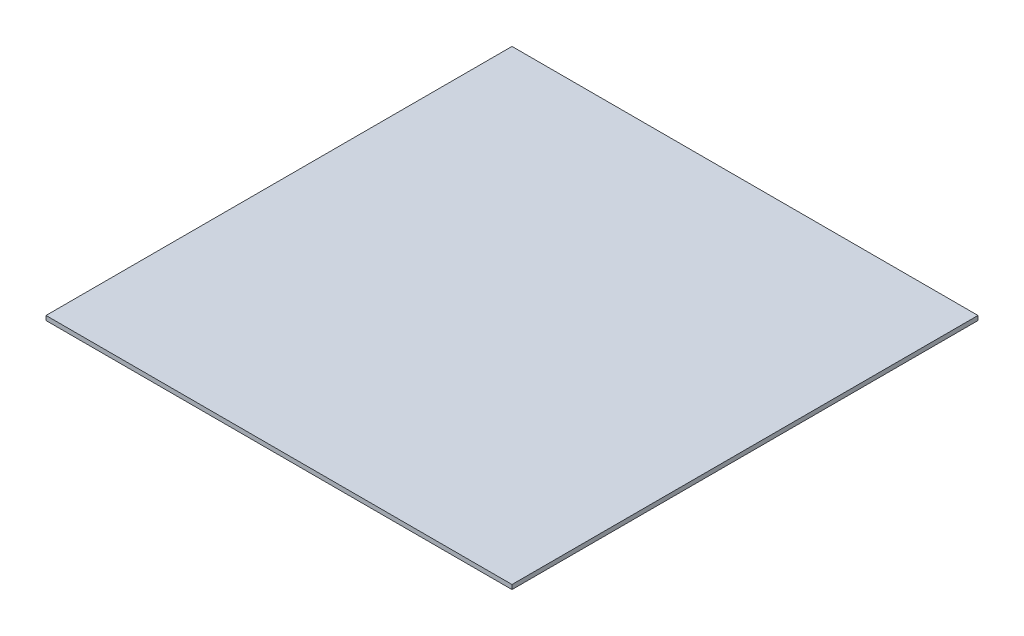
ISO-10303-21;
HEADER;
FILE_DESCRIPTION(('STEP AP214'),'2;1');
FILE_NAME('part.step','',(''),(''),'','','');
FILE_SCHEMA(('AUTOMOTIVE_DESIGN { 1 0 10303 214 1 1 1 1 }'));
ENDSEC;
DATA;
#1=APPLICATION_CONTEXT('core data for automotive mechanical design processes');
#2=APPLICATION_PROTOCOL_DEFINITION('international standard','automotive_design',2000,#1);
#3=PRODUCT_CONTEXT('',#1,'mechanical');
#4=PRODUCT('Part','Part','',(#3));
#5=PRODUCT_RELATED_PRODUCT_CATEGORY('part','',(#4));
#6=PRODUCT_DEFINITION_FORMATION('','',#4);
#7=PRODUCT_DEFINITION_CONTEXT('part definition',#1,'design');
#8=PRODUCT_DEFINITION('design','',#6,#7);
#9=PRODUCT_DEFINITION_SHAPE('','',#8);
#10=(LENGTH_UNIT() NAMED_UNIT(*) SI_UNIT(.MILLI.,.METRE.));
#11=(NAMED_UNIT(*) PLANE_ANGLE_UNIT() SI_UNIT($,.RADIAN.));
#12=(NAMED_UNIT(*) SI_UNIT($,.STERADIAN.) SOLID_ANGLE_UNIT());
#13=UNCERTAINTY_MEASURE_WITH_UNIT(LENGTH_MEASURE(1.E-05),#10,'distance_accuracy_value','');
#14=(GEOMETRIC_REPRESENTATION_CONTEXT(3) GLOBAL_UNCERTAINTY_ASSIGNED_CONTEXT((#13)) GLOBAL_UNIT_ASSIGNED_CONTEXT((#10,
#11,#12)) REPRESENTATION_CONTEXT('',''));
#15=CARTESIAN_POINT('',(0.,0.,0.));
#16=DIRECTION('',(0.,0.,1.));
#17=DIRECTION('',(1.,0.,0.));
#18=AXIS2_PLACEMENT_3D('',#15,#16,#17);
#19=CARTESIAN_POINT('',(200.,3.8,200.));
#20=DIRECTION('',(-1.,0.,0.));
#21=DIRECTION('',(0.,0.,1.));
#22=AXIS2_PLACEMENT_3D('',#19,#20,#21);
#23=PLANE('',#22);
#24=DIRECTION('',(0.,0.,-1.));
#25=VECTOR('',#24,1.);
#26=CARTESIAN_POINT('',(200.,0.,200.));
#27=LINE('',#26,#25);
#28=CARTESIAN_POINT('',(200.,0.,200.));
#29=VERTEX_POINT('',#28);
#30=CARTESIAN_POINT('',(200.,0.,-200.));
#31=VERTEX_POINT('',#30);
#32=EDGE_CURVE('E100',#29,#31,#27,.T.);
#33=ORIENTED_EDGE('',*,*,#32,.T.);
#34=DIRECTION('',(0.,-1.,0.));
#35=VECTOR('',#34,1.);
#36=CARTESIAN_POINT('',(200.,3.8,-200.));
#37=LINE('',#36,#35);
#38=CARTESIAN_POINT('',(200.,3.8,-200.));
#39=VERTEX_POINT('',#38);
#40=EDGE_CURVE('E11',#39,#31,#37,.T.);
#41=ORIENTED_EDGE('',*,*,#40,.F.);
#42=DIRECTION('',(0.,0.,-1.));
#43=VECTOR('',#42,1.);
#44=CARTESIAN_POINT('',(200.,3.8,200.));
#45=LINE('',#44,#43);
#46=CARTESIAN_POINT('',(200.,3.8,200.));
#47=VERTEX_POINT('',#46);
#48=EDGE_CURVE('E88',#47,#39,#45,.T.);
#49=ORIENTED_EDGE('',*,*,#48,.F.);
#50=DIRECTION('',(0.,-1.,0.));
#51=VECTOR('',#50,1.);
#52=CARTESIAN_POINT('',(200.,3.8,200.));
#53=LINE('',#52,#51);
#54=EDGE_CURVE('E96',#47,#29,#53,.T.);
#55=ORIENTED_EDGE('',*,*,#54,.T.);
#56=EDGE_LOOP('',(#33,#41,#49,#55));
#57=FACE_BOUND('',#56,.T.);
#58=ADVANCED_FACE('F37',(#57),#23,.F.);
#59=CARTESIAN_POINT('',(-200.,3.8,-200.));
#60=DIRECTION('',(0.,0.,1.));
#61=DIRECTION('',(1.,0.,0.));
#62=AXIS2_PLACEMENT_3D('',#59,#60,#61);
#63=PLANE('',#62);
#64=DIRECTION('',(-1.,0.,0.));
#65=VECTOR('',#64,1.);
#66=CARTESIAN_POINT('',(-200.,0.,-200.));
#67=LINE('',#66,#65);
#68=CARTESIAN_POINT('',(-200.,0.,-200.));
#69=VERTEX_POINT('',#68);
#70=EDGE_CURVE('E92',#31,#69,#67,.T.);
#71=ORIENTED_EDGE('',*,*,#70,.T.);
#72=DIRECTION('',(0.,-1.,0.));
#73=VECTOR('',#72,1.);
#74=CARTESIAN_POINT('',(-200.,3.8,-200.));
#75=LINE('',#74,#73);
#76=CARTESIAN_POINT('',(-200.,3.8,-200.));
#77=VERTEX_POINT('',#76);
#78=EDGE_CURVE('E45',#77,#69,#75,.T.);
#79=ORIENTED_EDGE('',*,*,#78,.F.);
#80=DIRECTION('',(-1.,0.,0.));
#81=VECTOR('',#80,1.);
#82=CARTESIAN_POINT('',(-200.,3.8,-200.));
#83=LINE('',#82,#81);
#84=EDGE_CURVE('E83',#39,#77,#83,.T.);
#85=ORIENTED_EDGE('',*,*,#84,.F.);
#86=ORIENTED_EDGE('',*,*,#40,.T.);
#87=EDGE_LOOP('',(#71,#79,#85,#86));
#88=FACE_BOUND('',#87,.T.);
#89=ADVANCED_FACE('F91',(#88),#63,.F.);
#90=CARTESIAN_POINT('',(-200.,3.8,200.));
#91=DIRECTION('',(1.,0.,0.));
#92=DIRECTION('',(0.,0.,-1.));
#93=AXIS2_PLACEMENT_3D('',#90,#91,#92);
#94=PLANE('',#93);
#95=DIRECTION('',(0.,0.,1.));
#96=VECTOR('',#95,1.);
#97=CARTESIAN_POINT('',(-200.,0.,200.));
#98=LINE('',#97,#96);
#99=CARTESIAN_POINT('',(-200.,0.,200.));
#100=VERTEX_POINT('',#99);
#101=EDGE_CURVE('E70',#69,#100,#98,.T.);
#102=ORIENTED_EDGE('',*,*,#101,.T.);
#103=DIRECTION('',(0.,-1.,0.));
#104=VECTOR('',#103,1.);
#105=CARTESIAN_POINT('',(-200.,3.8,200.));
#106=LINE('',#105,#104);
#107=CARTESIAN_POINT('',(-200.,3.8,200.));
#108=VERTEX_POINT('',#107);
#109=EDGE_CURVE('E93',#108,#100,#106,.T.);
#110=ORIENTED_EDGE('',*,*,#109,.F.);
#111=DIRECTION('',(0.,0.,1.));
#112=VECTOR('',#111,1.);
#113=CARTESIAN_POINT('',(-200.,3.8,200.));
#114=LINE('',#113,#112);
#115=EDGE_CURVE('E86',#77,#108,#114,.T.);
#116=ORIENTED_EDGE('',*,*,#115,.F.);
#117=ORIENTED_EDGE('',*,*,#78,.T.);
#118=EDGE_LOOP('',(#102,#110,#116,#117));
#119=FACE_BOUND('',#118,.T.);
#120=ADVANCED_FACE('F94',(#119),#94,.F.);
#121=CARTESIAN_POINT('',(-200.,3.8,200.));
#122=DIRECTION('',(0.,0.,-1.));
#123=DIRECTION('',(-1.,0.,0.));
#124=AXIS2_PLACEMENT_3D('',#121,#122,#123);
#125=PLANE('',#124);
#126=DIRECTION('',(1.,0.,0.));
#127=VECTOR('',#126,1.);
#128=CARTESIAN_POINT('',(-200.,0.,200.));
#129=LINE('',#128,#127);
#130=EDGE_CURVE('E76',#100,#29,#129,.T.);
#131=ORIENTED_EDGE('',*,*,#130,.T.);
#132=ORIENTED_EDGE('',*,*,#54,.F.);
#133=DIRECTION('',(1.,0.,0.));
#134=VECTOR('',#133,1.);
#135=CARTESIAN_POINT('',(-200.,3.8,200.));
#136=LINE('',#135,#134);
#137=EDGE_CURVE('E53',#108,#47,#136,.T.);
#138=ORIENTED_EDGE('',*,*,#137,.F.);
#139=ORIENTED_EDGE('',*,*,#109,.T.);
#140=EDGE_LOOP('',(#131,#132,#138,#139));
#141=FACE_BOUND('',#140,.T.);
#142=ADVANCED_FACE('F107',(#141),#125,.F.);
#143=CARTESIAN_POINT('',(0.,3.8,0.));
#144=DIRECTION('',(0.,-1.,0.));
#145=DIRECTION('',(0.,0.,-1.));
#146=AXIS2_PLACEMENT_3D('',#143,#144,#145);
#147=PLANE('',#146);
#148=ORIENTED_EDGE('',*,*,#48,.T.);
#149=ORIENTED_EDGE('',*,*,#84,.T.);
#150=ORIENTED_EDGE('',*,*,#115,.T.);
#151=ORIENTED_EDGE('',*,*,#137,.T.);
#152=EDGE_LOOP('',(#148,#149,#150,#151));
#153=FACE_BOUND('',#152,.T.);
#154=ADVANCED_FACE('F84',(#153),#147,.F.);
#155=CARTESIAN_POINT('',(0.,0.,0.));
#156=DIRECTION('',(0.,-1.,0.));
#157=DIRECTION('',(0.,0.,-1.));
#158=AXIS2_PLACEMENT_3D('',#155,#156,#157);
#159=PLANE('',#158);
#160=ORIENTED_EDGE('',*,*,#32,.F.);
#161=ORIENTED_EDGE('',*,*,#130,.F.);
#162=ORIENTED_EDGE('',*,*,#101,.F.);
#163=ORIENTED_EDGE('',*,*,#70,.F.);
#164=EDGE_LOOP('',(#160,#161,#162,#163));
#165=FACE_BOUND('',#164,.T.);
#166=ADVANCED_FACE('F110',(#165),#159,.T.);
#167=CLOSED_SHELL('',(#58,#89,#120,#142,#154,#166));
#168=MANIFOLD_SOLID_BREP('B2',#167);
#169=ADVANCED_BREP_SHAPE_REPRESENTATION('',(#18,#168),#14);
#170=SHAPE_DEFINITION_REPRESENTATION(#9,#169);
ENDSEC;
END-ISO-10303-21;
